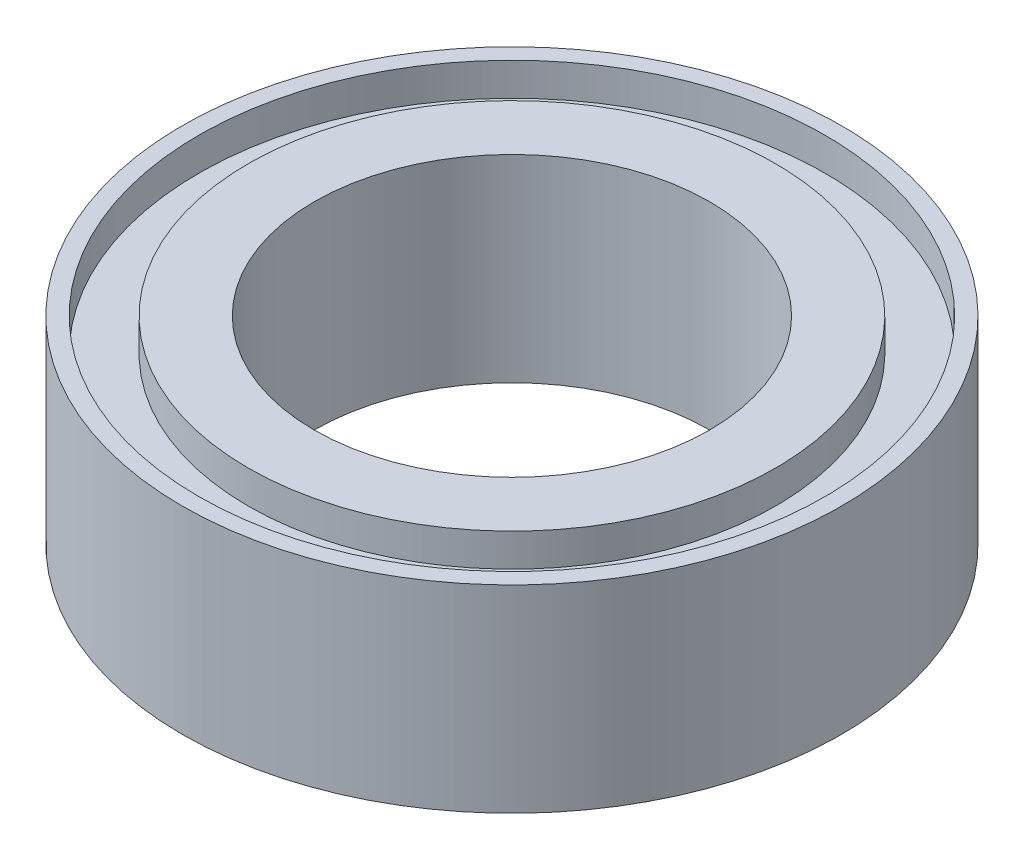
ISO-10303-21;
HEADER;
FILE_DESCRIPTION(('STEP AP214'),'2;1');
FILE_NAME('part.step','',(''),(''),'','','');
FILE_SCHEMA(('AUTOMOTIVE_DESIGN { 1 0 10303 214 1 1 1 1 }'));
ENDSEC;
DATA;
#1=APPLICATION_CONTEXT('core data for automotive mechanical design processes');
#2=APPLICATION_PROTOCOL_DEFINITION('international standard','automotive_design',2000,#1);
#3=PRODUCT_CONTEXT('',#1,'mechanical');
#4=PRODUCT('Part','Part','',(#3));
#5=PRODUCT_RELATED_PRODUCT_CATEGORY('part','',(#4));
#6=PRODUCT_DEFINITION_FORMATION('','',#4);
#7=PRODUCT_DEFINITION_CONTEXT('part definition',#1,'design');
#8=PRODUCT_DEFINITION('design','',#6,#7);
#9=PRODUCT_DEFINITION_SHAPE('','',#8);
#10=(LENGTH_UNIT() NAMED_UNIT(*) SI_UNIT(.MILLI.,.METRE.));
#11=(NAMED_UNIT(*) PLANE_ANGLE_UNIT() SI_UNIT($,.RADIAN.));
#12=(NAMED_UNIT(*) SI_UNIT($,.STERADIAN.) SOLID_ANGLE_UNIT());
#13=UNCERTAINTY_MEASURE_WITH_UNIT(LENGTH_MEASURE(1.E-05),#10,'distance_accuracy_value','');
#14=(GEOMETRIC_REPRESENTATION_CONTEXT(3) GLOBAL_UNCERTAINTY_ASSIGNED_CONTEXT((#13)) GLOBAL_UNIT_ASSIGNED_CONTEXT((#10,
#11,#12)) REPRESENTATION_CONTEXT('',''));
#15=CARTESIAN_POINT('',(0.,0.,0.));
#16=DIRECTION('',(0.,0.,1.));
#17=DIRECTION('',(1.,0.,0.));
#18=AXIS2_PLACEMENT_3D('',#15,#16,#17);
#19=CARTESIAN_POINT('',(0.,1.5,0.));
#20=DIRECTION('',(0.,-1.,0.));
#21=DIRECTION('',(0.,0.,-1.));
#22=AXIS2_PLACEMENT_3D('',#19,#20,#21);
#23=CYLINDRICAL_SURFACE('',#22,4.75);
#24=CARTESIAN_POINT('',(0.,-1.5,0.));
#25=DIRECTION('',(0.,1.,0.));
#26=DIRECTION('',(0.,0.,1.));
#27=AXIS2_PLACEMENT_3D('',#24,#25,#26);
#28=CIRCLE('',#27,4.75);
#29=CARTESIAN_POINT('',(0.,-1.5,4.75));
#30=VERTEX_POINT('',#29);
#31=EDGE_CURVE('E64',#30,#30,#28,.T.);
#32=ORIENTED_EDGE('',*,*,#31,.F.);
#33=EDGE_LOOP('',(#32));
#34=FACE_BOUND('',#33,.T.);
#35=CARTESIAN_POINT('',(0.,-1.,0.));
#36=DIRECTION('',(0.,1.,0.));
#37=DIRECTION('',(0.,0.,1.));
#38=AXIS2_PLACEMENT_3D('',#35,#36,#37);
#39=CIRCLE('',#38,4.75);
#40=CARTESIAN_POINT('',(0.,-1.,4.75));
#41=VERTEX_POINT('',#40);
#42=EDGE_CURVE('E97',#41,#41,#39,.T.);
#43=ORIENTED_EDGE('',*,*,#42,.T.);
#44=EDGE_LOOP('',(#43));
#45=FACE_BOUND('',#44,.T.);
#46=ADVANCED_FACE('F44',(#34,#45),#23,.F.);
#47=CARTESIAN_POINT('',(0.,1.,0.));
#48=DIRECTION('',(0.,1.,0.));
#49=DIRECTION('',(0.,0.,1.));
#50=AXIS2_PLACEMENT_3D('',#47,#48,#49);
#51=CIRCLE('',#50,4.75);
#52=CARTESIAN_POINT('',(0.,1.,4.75));
#53=VERTEX_POINT('',#52);
#54=EDGE_CURVE('E11',#53,#53,#51,.T.);
#55=ORIENTED_EDGE('',*,*,#54,.F.);
#56=EDGE_LOOP('',(#55));
#57=FACE_BOUND('',#56,.T.);
#58=CARTESIAN_POINT('',(0.,1.5,0.));
#59=DIRECTION('',(0.,1.,0.));
#60=DIRECTION('',(0.,0.,1.));
#61=AXIS2_PLACEMENT_3D('',#58,#59,#60);
#62=CIRCLE('',#61,4.75);
#63=CARTESIAN_POINT('',(0.,1.5,4.75));
#64=VERTEX_POINT('',#63);
#65=EDGE_CURVE('E55',#64,#64,#62,.T.);
#66=ORIENTED_EDGE('',*,*,#65,.T.);
#67=EDGE_LOOP('',(#66));
#68=FACE_BOUND('',#67,.T.);
#69=ADVANCED_FACE('F46',(#57,#68),#23,.F.);
#70=CARTESIAN_POINT('',(0.,1.5,0.));
#71=DIRECTION('',(0.,-1.,0.));
#72=DIRECTION('',(0.,0.,-1.));
#73=AXIS2_PLACEMENT_3D('',#70,#71,#72);
#74=CYLINDRICAL_SURFACE('',#73,5.);
#75=CARTESIAN_POINT('',(0.,1.5,0.));
#76=DIRECTION('',(0.,1.,0.));
#77=DIRECTION('',(0.,0.,1.));
#78=AXIS2_PLACEMENT_3D('',#75,#76,#77);
#79=CIRCLE('',#78,5.);
#80=CARTESIAN_POINT('',(0.,1.5,5.));
#81=VERTEX_POINT('',#80);
#82=EDGE_CURVE('E51',#81,#81,#79,.T.);
#83=ORIENTED_EDGE('',*,*,#82,.F.);
#84=EDGE_LOOP('',(#83));
#85=FACE_BOUND('',#84,.T.);
#86=CARTESIAN_POINT('',(0.,-1.5,0.));
#87=DIRECTION('',(0.,1.,0.));
#88=DIRECTION('',(0.,0.,1.));
#89=AXIS2_PLACEMENT_3D('',#86,#87,#88);
#90=CIRCLE('',#89,5.);
#91=CARTESIAN_POINT('',(0.,-1.5,5.));
#92=VERTEX_POINT('',#91);
#93=EDGE_CURVE('E60',#92,#92,#90,.T.);
#94=ORIENTED_EDGE('',*,*,#93,.T.);
#95=EDGE_LOOP('',(#94));
#96=FACE_BOUND('',#95,.T.);
#97=ADVANCED_FACE('F70',(#85,#96),#74,.T.);
#98=CARTESIAN_POINT('',(0.,1.5,0.));
#99=DIRECTION('',(0.,1.,0.));
#100=DIRECTION('',(0.,0.,1.));
#101=AXIS2_PLACEMENT_3D('',#98,#99,#100);
#102=PLANE('',#101);
#103=ORIENTED_EDGE('',*,*,#65,.F.);
#104=EDGE_LOOP('',(#103));
#105=FACE_BOUND('',#104,.T.);
#106=ORIENTED_EDGE('',*,*,#82,.T.);
#107=EDGE_LOOP('',(#106));
#108=FACE_BOUND('',#107,.T.);
#109=ADVANCED_FACE('F75',(#105,#108),#102,.T.);
#110=CARTESIAN_POINT('',(0.,-1.5,0.));
#111=DIRECTION('',(0.,1.,0.));
#112=DIRECTION('',(0.,0.,1.));
#113=AXIS2_PLACEMENT_3D('',#110,#111,#112);
#114=PLANE('',#113);
#115=ORIENTED_EDGE('',*,*,#31,.T.);
#116=EDGE_LOOP('',(#115));
#117=FACE_BOUND('',#116,.T.);
#118=ORIENTED_EDGE('',*,*,#93,.F.);
#119=EDGE_LOOP('',(#118));
#120=FACE_BOUND('',#119,.T.);
#121=ADVANCED_FACE('F72',(#117,#120),#114,.F.);
#122=CARTESIAN_POINT('',(0.,1.,0.));
#123=DIRECTION('',(0.,1.,0.));
#124=DIRECTION('',(0.,0.,1.));
#125=AXIS2_PLACEMENT_3D('',#122,#123,#124);
#126=PLANE('',#125);
#127=CARTESIAN_POINT('',(0.,1.,0.));
#128=DIRECTION('',(0.,1.,0.));
#129=DIRECTION('',(0.,0.,1.));
#130=AXIS2_PLACEMENT_3D('',#127,#128,#129);
#131=CIRCLE('',#130,4.);
#132=CARTESIAN_POINT('',(0.,1.,4.));
#133=VERTEX_POINT('',#132);
#134=EDGE_CURVE('E66',#133,#133,#131,.T.);
#135=ORIENTED_EDGE('',*,*,#134,.F.);
#136=EDGE_LOOP('',(#135));
#137=FACE_BOUND('',#136,.T.);
#138=ORIENTED_EDGE('',*,*,#54,.T.);
#139=EDGE_LOOP('',(#138));
#140=FACE_BOUND('',#139,.T.);
#141=ADVANCED_FACE('F74',(#137,#140),#126,.T.);
#142=CARTESIAN_POINT('',(0.,-1.,0.));
#143=DIRECTION('',(0.,1.,0.));
#144=DIRECTION('',(0.,0.,1.));
#145=AXIS2_PLACEMENT_3D('',#142,#143,#144);
#146=PLANE('',#145);
#147=CARTESIAN_POINT('',(0.,-1.,0.));
#148=DIRECTION('',(0.,1.,0.));
#149=DIRECTION('',(0.,0.,1.));
#150=AXIS2_PLACEMENT_3D('',#147,#148,#149);
#151=CIRCLE('',#150,4.);
#152=CARTESIAN_POINT('',(0.,-1.,4.));
#153=VERTEX_POINT('',#152);
#154=EDGE_CURVE('E99',#153,#153,#151,.F.);
#155=ORIENTED_EDGE('',*,*,#154,.F.);
#156=EDGE_LOOP('',(#155));
#157=FACE_BOUND('',#156,.T.);
#158=ORIENTED_EDGE('',*,*,#42,.F.);
#159=EDGE_LOOP('',(#158));
#160=FACE_BOUND('',#159,.T.);
#161=ADVANCED_FACE('F82',(#157,#160),#146,.F.);
#162=CARTESIAN_POINT('',(0.,1.5,0.));
#163=DIRECTION('',(0.,-1.,0.));
#164=DIRECTION('',(0.,0.,-1.));
#165=AXIS2_PLACEMENT_3D('',#162,#163,#164);
#166=CYLINDRICAL_SURFACE('',#165,4.);
#167=CARTESIAN_POINT('',(0.,-1.5,0.));
#168=DIRECTION('',(0.,1.,0.));
#169=DIRECTION('',(0.,0.,1.));
#170=AXIS2_PLACEMENT_3D('',#167,#168,#169);
#171=CIRCLE('',#170,4.);
#172=CARTESIAN_POINT('',(0.,-1.5,4.));
#173=VERTEX_POINT('',#172);
#174=EDGE_CURVE('E106',#173,#173,#171,.T.);
#175=ORIENTED_EDGE('',*,*,#174,.T.);
#176=EDGE_LOOP('',(#175));
#177=FACE_BOUND('',#176,.T.);
#178=ORIENTED_EDGE('',*,*,#154,.T.);
#179=EDGE_LOOP('',(#178));
#180=FACE_BOUND('',#179,.T.);
#181=ADVANCED_FACE('F132',(#177,#180),#166,.T.);
#182=CARTESIAN_POINT('',(0.,1.5,0.));
#183=DIRECTION('',(0.,-1.,0.));
#184=DIRECTION('',(0.,0.,-1.));
#185=AXIS2_PLACEMENT_3D('',#182,#183,#184);
#186=CYLINDRICAL_SURFACE('',#185,3.);
#187=CARTESIAN_POINT('',(0.,1.5,0.));
#188=DIRECTION('',(0.,1.,0.));
#189=DIRECTION('',(0.,0.,1.));
#190=AXIS2_PLACEMENT_3D('',#187,#188,#189);
#191=CIRCLE('',#190,3.);
#192=CARTESIAN_POINT('',(0.,1.5,3.));
#193=VERTEX_POINT('',#192);
#194=EDGE_CURVE('E109',#193,#193,#191,.T.);
#195=ORIENTED_EDGE('',*,*,#194,.T.);
#196=EDGE_LOOP('',(#195));
#197=FACE_BOUND('',#196,.T.);
#198=CARTESIAN_POINT('',(0.,-1.5,0.));
#199=DIRECTION('',(0.,1.,0.));
#200=DIRECTION('',(0.,0.,1.));
#201=AXIS2_PLACEMENT_3D('',#198,#199,#200);
#202=CIRCLE('',#201,3.);
#203=CARTESIAN_POINT('',(0.,-1.5,3.));
#204=VERTEX_POINT('',#203);
#205=EDGE_CURVE('E110',#204,#204,#202,.T.);
#206=ORIENTED_EDGE('',*,*,#205,.F.);
#207=EDGE_LOOP('',(#206));
#208=FACE_BOUND('',#207,.T.);
#209=ADVANCED_FACE('F118',(#197,#208),#186,.F.);
#210=ORIENTED_EDGE('',*,*,#134,.T.);
#211=EDGE_LOOP('',(#210));
#212=FACE_BOUND('',#211,.T.);
#213=CARTESIAN_POINT('',(0.,1.5,0.));
#214=DIRECTION('',(0.,1.,0.));
#215=DIRECTION('',(0.,0.,1.));
#216=AXIS2_PLACEMENT_3D('',#213,#214,#215);
#217=CIRCLE('',#216,4.);
#218=CARTESIAN_POINT('',(0.,1.5,4.));
#219=VERTEX_POINT('',#218);
#220=EDGE_CURVE('E103',#219,#219,#217,.T.);
#221=ORIENTED_EDGE('',*,*,#220,.F.);
#222=EDGE_LOOP('',(#221));
#223=FACE_BOUND('',#222,.T.);
#224=ADVANCED_FACE('F125',(#212,#223),#166,.T.);
#225=CARTESIAN_POINT('',(0.,1.5,0.));
#226=DIRECTION('',(0.,1.,0.));
#227=DIRECTION('',(0.,0.,1.));
#228=AXIS2_PLACEMENT_3D('',#225,#226,#227);
#229=PLANE('',#228);
#230=ORIENTED_EDGE('',*,*,#194,.F.);
#231=EDGE_LOOP('',(#230));
#232=FACE_BOUND('',#231,.T.);
#233=ORIENTED_EDGE('',*,*,#220,.T.);
#234=EDGE_LOOP('',(#233));
#235=FACE_BOUND('',#234,.T.);
#236=ADVANCED_FACE('F121',(#232,#235),#229,.T.);
#237=CARTESIAN_POINT('',(0.,-1.5,0.));
#238=DIRECTION('',(0.,1.,0.));
#239=DIRECTION('',(0.,0.,1.));
#240=AXIS2_PLACEMENT_3D('',#237,#238,#239);
#241=PLANE('',#240);
#242=ORIENTED_EDGE('',*,*,#205,.T.);
#243=EDGE_LOOP('',(#242));
#244=FACE_BOUND('',#243,.T.);
#245=ORIENTED_EDGE('',*,*,#174,.F.);
#246=EDGE_LOOP('',(#245));
#247=FACE_BOUND('',#246,.T.);
#248=ADVANCED_FACE('F124',(#244,#247),#241,.F.);
#249=CLOSED_SHELL('',(#46,#69,#97,#109,#121,#141,#161,#181,#209,#224,#236,#248));
#250=MANIFOLD_SOLID_BREP('B2',#249);
#251=ADVANCED_BREP_SHAPE_REPRESENTATION('',(#18,#250),#14);
#252=SHAPE_DEFINITION_REPRESENTATION(#9,#251);
ENDSEC;
END-ISO-10303-21;
